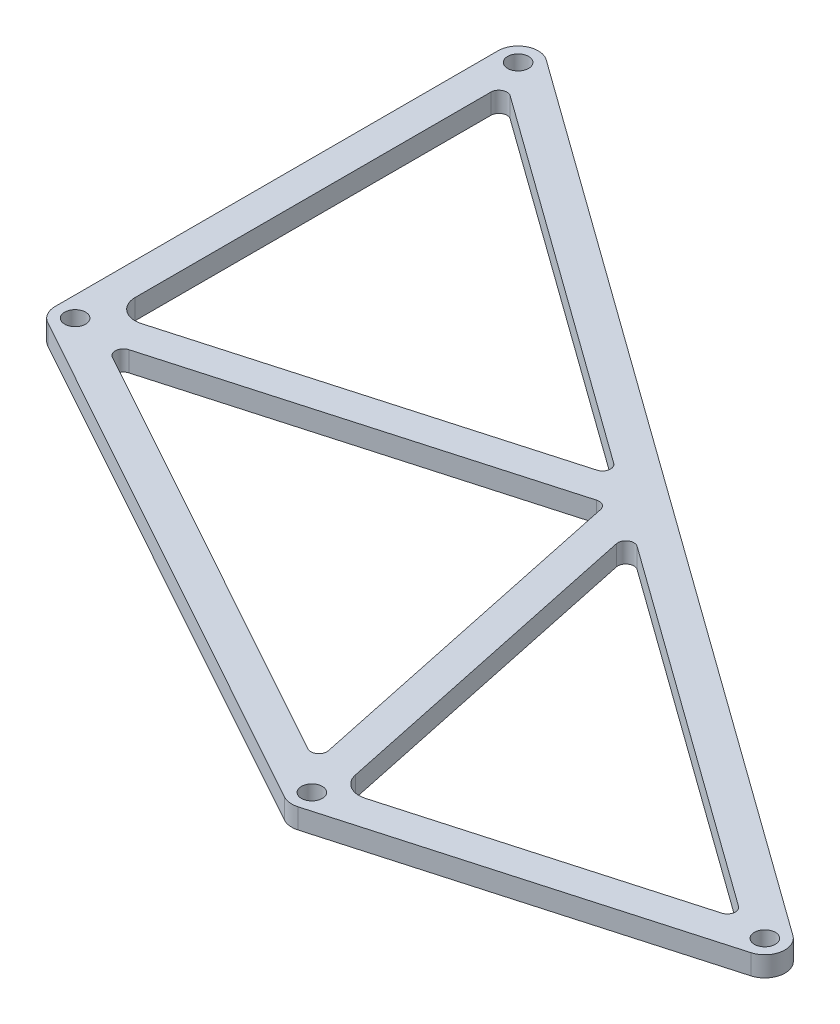
ISO-10303-21;
HEADER;
FILE_DESCRIPTION(('STEP AP214'),'2;1');
FILE_NAME('part.step','',(''),(''),'','','');
FILE_SCHEMA(('AUTOMOTIVE_DESIGN { 1 0 10303 214 1 1 1 1 }'));
ENDSEC;
DATA;
#1=APPLICATION_CONTEXT('core data for automotive mechanical design processes');
#2=APPLICATION_PROTOCOL_DEFINITION('international standard','automotive_design',2000,#1);
#3=PRODUCT_CONTEXT('',#1,'mechanical');
#4=PRODUCT('Part','Part','',(#3));
#5=PRODUCT_RELATED_PRODUCT_CATEGORY('part','',(#4));
#6=PRODUCT_DEFINITION_FORMATION('','',#4);
#7=PRODUCT_DEFINITION_CONTEXT('part definition',#1,'design');
#8=PRODUCT_DEFINITION('design','',#6,#7);
#9=PRODUCT_DEFINITION_SHAPE('','',#8);
#10=(LENGTH_UNIT() NAMED_UNIT(*) SI_UNIT(.MILLI.,.METRE.));
#11=(NAMED_UNIT(*) PLANE_ANGLE_UNIT() SI_UNIT($,.RADIAN.));
#12=(NAMED_UNIT(*) SI_UNIT($,.STERADIAN.) SOLID_ANGLE_UNIT());
#13=UNCERTAINTY_MEASURE_WITH_UNIT(LENGTH_MEASURE(1.E-05),#10,'distance_accuracy_value','');
#14=(GEOMETRIC_REPRESENTATION_CONTEXT(3) GLOBAL_UNCERTAINTY_ASSIGNED_CONTEXT((#13)) GLOBAL_UNIT_ASSIGNED_CONTEXT((#10,
#11,#12)) REPRESENTATION_CONTEXT('',''));
#15=CARTESIAN_POINT('',(0.,0.,0.));
#16=DIRECTION('',(0.,0.,1.));
#17=DIRECTION('',(1.,0.,0.));
#18=AXIS2_PLACEMENT_3D('',#15,#16,#17);
#19=CARTESIAN_POINT('',(-52.0637490387797,6.35,-91.7821141421089));
#20=DIRECTION('',(0.,1.,0.));
#21=DIRECTION('',(0.,0.,1.));
#22=AXIS2_PLACEMENT_3D('',#19,#20,#21);
#23=PLANE('',#22);
#24=CARTESIAN_POINT('',(-330.2,6.35,-152.4));
#25=DIRECTION('',(0.,1.,0.));
#26=DIRECTION('',(0.,0.,1.));
#27=AXIS2_PLACEMENT_3D('',#24,#25,#26);
#28=CIRCLE('',#27,3.30200000000004);
#29=CARTESIAN_POINT('',(-330.2,6.35,-149.098));
#30=VERTEX_POINT('',#29);
#31=EDGE_CURVE('E418',#30,#30,#28,.T.);
#32=ORIENTED_EDGE('',*,*,#31,.F.);
#33=EDGE_LOOP('',(#32));
#34=FACE_BOUND('',#33,.T.);
#35=CARTESIAN_POINT('',(-52.0637490387797,6.35,-91.7821141421089));
#36=DIRECTION('',(0.,1.,0.));
#37=DIRECTION('',(0.,0.,1.));
#38=AXIS2_PLACEMENT_3D('',#35,#36,#37);
#39=CIRCLE('',#38,3.302);
#40=CARTESIAN_POINT('',(-52.0637490387797,6.35,-88.4801141421089));
#41=VERTEX_POINT('',#40);
#42=EDGE_CURVE('E430',#41,#41,#39,.T.);
#43=ORIENTED_EDGE('',*,*,#42,.F.);
#44=EDGE_LOOP('',(#43));
#45=FACE_BOUND('',#44,.T.);
#46=CARTESIAN_POINT('',(-52.0637490387797,6.35,-91.7821141421089));
#47=DIRECTION('',(0.,1.,0.));
#48=DIRECTION('',(0.,0.,1.));
#49=AXIS2_PLACEMENT_3D('',#46,#47,#48);
#50=CIRCLE('',#49,6.34999999999994);
#51=CARTESIAN_POINT('',(-50.3303107807158,6.35,-85.6732933225498));
#52=VERTEX_POINT('',#51);
#53=CARTESIAN_POINT('',(-48.3526846328268,6.35,-96.9348319662158));
#54=VERTEX_POINT('',#53);
#55=EDGE_CURVE('E259',#52,#54,#50,.T.);
#56=ORIENTED_EDGE('',*,*,#55,.T.);
#57=DIRECTION('',(-0.811451625843612,0.,-0.584419591488649));
#58=VECTOR('',#57,1.);
#59=CARTESIAN_POINT('',(-48.3526846328268,6.35,-96.9348319662158));
#60=LINE('',#59,#58);
#61=CARTESIAN_POINT('',(-326.488935594047,6.35,-297.252717824107));
#62=VERTEX_POINT('',#61);
#63=EDGE_CURVE('E248',#54,#62,#60,.T.);
#64=ORIENTED_EDGE('',*,*,#63,.T.);
#65=CARTESIAN_POINT('',(-330.2,6.35,-292.1));
#66=DIRECTION('',(0.,1.,0.));
#67=DIRECTION('',(0.,0.,1.));
#68=AXIS2_PLACEMENT_3D('',#65,#66,#67);
#69=CIRCLE('',#68,6.34999999999996);
#70=CARTESIAN_POINT('',(-336.55,6.35,-292.1));
#71=VERTEX_POINT('',#70);
#72=EDGE_CURVE('E258',#62,#71,#69,.T.);
#73=ORIENTED_EDGE('',*,*,#72,.T.);
#74=DIRECTION('',(0.,0.,1.));
#75=VECTOR('',#74,1.);
#76=CARTESIAN_POINT('',(-336.55,6.35,-292.1));
#77=LINE('',#76,#75);
#78=CARTESIAN_POINT('',(-336.55,6.35,-152.4));
#79=VERTEX_POINT('',#78);
#80=EDGE_CURVE('E436',#71,#79,#77,.T.);
#81=ORIENTED_EDGE('',*,*,#80,.T.);
#82=CARTESIAN_POINT('',(-330.2,6.35,-152.4));
#83=DIRECTION('',(0.,1.,0.));
#84=DIRECTION('',(0.,0.,-1.));
#85=AXIS2_PLACEMENT_3D('',#82,#83,#84);
#86=CIRCLE('',#85,6.34999999999993);
#87=CARTESIAN_POINT('',(-333.271040517712,6.35,-146.842013841456));
#88=VERTEX_POINT('',#87);
#89=EDGE_CURVE('E438',#79,#88,#86,.T.);
#90=ORIENTED_EDGE('',*,*,#89,.T.);
#91=DIRECTION('',(0.875273410794368,0.,0.48362842798619));
#92=VECTOR('',#91,1.);
#93=CARTESIAN_POINT('',(-166.415977763352,6.35,-54.6469914561744));
#94=LINE('',#93,#92);
#95=CARTESIAN_POINT('',(-166.415977763352,6.35,-54.6469914561744));
#96=VERTEX_POINT('',#95);
#97=EDGE_CURVE('E440',#88,#96,#94,.T.);
#98=ORIENTED_EDGE('',*,*,#97,.T.);
#99=CARTESIAN_POINT('',(-163.34493724564,6.35,-60.2049776147186));
#100=DIRECTION('',(0.,1.,0.));
#101=DIRECTION('',(0.,0.,-1.));
#102=AXIS2_PLACEMENT_3D('',#99,#100,#101);
#103=CIRCLE('',#102,6.34999999999996);
#104=CARTESIAN_POINT('',(-161.611498987576,6.35,-54.0961567951594));
#105=VERTEX_POINT('',#104);
#106=EDGE_CURVE('E442',#96,#105,#103,.T.);
#107=ORIENTED_EDGE('',*,*,#106,.T.);
#108=DIRECTION('',(0.96201902670224,0.,-0.272982402844717));
#109=VECTOR('',#108,1.);
#110=CARTESIAN_POINT('',(-161.611498987576,6.35,-54.0961567951594));
#111=LINE('',#110,#109);
#112=EDGE_CURVE('E264',#105,#52,#111,.T.);
#113=ORIENTED_EDGE('',*,*,#112,.T.);
#114=EDGE_LOOP('',(#56,#64,#73,#81,#90,#98,#107,#113));
#115=FACE_BOUND('',#114,.T.);
#116=CARTESIAN_POINT('',(-163.34493724564,6.35,-60.2049776147186));
#117=DIRECTION('',(0.,1.,0.));
#118=DIRECTION('',(0.,0.,1.));
#119=AXIS2_PLACEMENT_3D('',#116,#117,#118);
#120=CIRCLE('',#119,3.30200000000004);
#121=CARTESIAN_POINT('',(-163.34493724564,6.35,-56.9029776147185));
#122=VERTEX_POINT('',#121);
#123=EDGE_CURVE('E424',#122,#122,#120,.T.);
#124=ORIENTED_EDGE('',*,*,#123,.F.);
#125=EDGE_LOOP('',(#124));
#126=FACE_BOUND('',#125,.T.);
#127=CARTESIAN_POINT('',(-330.2,6.35,-292.1));
#128=DIRECTION('',(0.,1.,0.));
#129=DIRECTION('',(0.,0.,1.));
#130=AXIS2_PLACEMENT_3D('',#127,#128,#129);
#131=CIRCLE('',#130,3.30200000000004);
#132=CARTESIAN_POINT('',(-330.2,6.35,-288.798));
#133=VERTEX_POINT('',#132);
#134=EDGE_CURVE('E412',#133,#133,#131,.T.);
#135=ORIENTED_EDGE('',*,*,#134,.F.);
#136=EDGE_LOOP('',(#135));
#137=FACE_BOUND('',#136,.T.);
#138=DIRECTION('',(0.811451625843611,0.,0.584419591488649));
#139=VECTOR('',#138,1.);
#140=CARTESIAN_POINT('',(-326.39,6.35,-284.660691911492));
#141=LINE('',#140,#139);
#142=CARTESIAN_POINT('',(-322.365574237619,6.35,-281.762240315462));
#143=VERTEX_POINT('',#142);
#144=CARTESIAN_POINT('',(-205.622667968464,6.35,-197.682254006868));
#145=VERTEX_POINT('',#144);
#146=EDGE_CURVE('E386',#143,#145,#141,.T.);
#147=ORIENTED_EDGE('',*,*,#146,.T.);
#148=CARTESIAN_POINT('',(-207.107093730845,6.35,-195.621166877225));
#149=DIRECTION('',(0.,1.,0.));
#150=DIRECTION('',(0.,0.,1.));
#151=AXIS2_PLACEMENT_3D('',#148,#149,#150);
#152=CIRCLE('',#151,2.54);
#153=CARTESIAN_POINT('',(-206.41243240115,6.35,-193.178003837839));
#154=VERTEX_POINT('',#153);
#155=EDGE_CURVE('E85',#145,#154,#152,.F.);
#156=ORIENTED_EDGE('',*,*,#155,.T.);
#157=DIRECTION('',(-0.961875212356985,0.,0.273488712478604));
#158=VECTOR('',#157,1.);
#159=CARTESIAN_POINT('',(-201.362327899527,6.35,-194.613893400526));
#160=LINE('',#159,#158);
#161=CARTESIAN_POINT('',(-318.303346675761,6.35,-161.364207526327));
#162=VERTEX_POINT('',#161);
#163=EDGE_CURVE('E408',#154,#162,#160,.T.);
#164=ORIENTED_EDGE('',*,*,#163,.T.);
#165=CARTESIAN_POINT('',(-320.04,6.35,-167.472115124794));
#166=DIRECTION('',(0.,1.,0.));
#167=DIRECTION('',(0.,0.,1.));
#168=AXIS2_PLACEMENT_3D('',#165,#166,#167);
#169=CIRCLE('',#168,6.35);
#170=CARTESIAN_POINT('',(-326.39,6.35,-167.472115124794));
#171=VERTEX_POINT('',#170);
#172=EDGE_CURVE('E312',#162,#171,#169,.F.);
#173=ORIENTED_EDGE('',*,*,#172,.T.);
#174=DIRECTION('',(0.,0.,-1.));
#175=VECTOR('',#174,1.);
#176=CARTESIAN_POINT('',(-326.39,6.35,-159.064940035602));
#177=LINE('',#176,#175);
#178=CARTESIAN_POINT('',(-326.39,6.35,-279.701153185819));
#179=VERTEX_POINT('',#178);
#180=EDGE_CURVE('E401',#171,#179,#177,.T.);
#181=ORIENTED_EDGE('',*,*,#180,.T.);
#182=CARTESIAN_POINT('',(-323.85,6.35,-279.701153185819));
#183=DIRECTION('',(0.,1.,0.));
#184=DIRECTION('',(0.,0.,1.));
#185=AXIS2_PLACEMENT_3D('',#182,#183,#184);
#186=CIRCLE('',#185,2.54);
#187=EDGE_CURVE('E332',#179,#143,#186,.F.);
#188=ORIENTED_EDGE('',*,*,#187,.T.);
#189=EDGE_LOOP('',(#147,#156,#164,#173,#181,#188));
#190=FACE_BOUND('',#189,.T.);
#191=DIRECTION('',(-0.206387599573482,0.,-0.978470315718518));
#192=VECTOR('',#191,1.);
#193=CARTESIAN_POINT('',(-159.839017864804,6.35,-65.1602375050574));
#194=LINE('',#193,#192);
#195=CARTESIAN_POINT('',(-161.242729048392,6.35,-71.8151418104572));
#196=VERTEX_POINT('',#195);
#197=CARTESIAN_POINT('',(-183.243670348003,6.35,-176.120187385014));
#198=VERTEX_POINT('',#197);
#199=EDGE_CURVE('E717',#196,#198,#194,.T.);
#200=ORIENTED_EDGE('',*,*,#199,.T.);
#201=CARTESIAN_POINT('',(-180.758355746078,6.35,-176.644411887931));
#202=DIRECTION('',(0.,1.,0.));
#203=DIRECTION('',(0.,0.,1.));
#204=AXIS2_PLACEMENT_3D('',#201,#202,#203);
#205=CIRCLE('',#204,2.54);
#206=CARTESIAN_POINT('',(-179.273929983697,6.35,-178.705499017573));
#207=VERTEX_POINT('',#206);
#208=EDGE_CURVE('E350',#198,#207,#205,.F.);
#209=ORIENTED_EDGE('',*,*,#208,.T.);
#210=DIRECTION('',(0.811451625843612,0.,0.584419591488649));
#211=VECTOR('',#210,1.);
#212=CARTESIAN_POINT('',(-184.597750493487,6.35,-182.539794135604));
#213=LINE('',#212,#211);
#214=CARTESIAN_POINT('',(-64.9483916318391,6.35,-96.3665372207435));
#215=VERTEX_POINT('',#214);
#216=EDGE_CURVE('E722',#207,#215,#213,.T.);
#217=ORIENTED_EDGE('',*,*,#216,.T.);
#218=CARTESIAN_POINT('',(-66.4328173942203,6.35,-94.3054500911007));
#219=DIRECTION('',(0.,1.,0.));
#220=DIRECTION('',(0.,0.,1.));
#221=AXIS2_PLACEMENT_3D('',#218,#219,#220);
#222=CIRCLE('',#221,2.54);
#223=CARTESIAN_POINT('',(-65.7394420909947,6.35,-91.8619217632771));
#224=VERTEX_POINT('',#223);
#225=EDGE_CURVE('E327',#215,#224,#222,.F.);
#226=ORIENTED_EDGE('',*,*,#225,.T.);
#227=DIRECTION('',(-0.962019026702239,0.,0.272982402844717));
#228=VECTOR('',#227,1.);
#229=CARTESIAN_POINT('',(-60.6851900520441,6.35,-93.296115711504));
#230=LINE('',#229,#228);
#231=CARTESIAN_POINT('',(-153.296004285515,6.35,-67.0168822481896));
#232=VERTEX_POINT('',#231);
#233=EDGE_CURVE('E395',#224,#232,#230,.T.);
#234=ORIENTED_EDGE('',*,*,#233,.T.);
#235=CARTESIAN_POINT('',(-155.029442543579,6.35,-73.1257030677488));
#236=DIRECTION('',(0.,1.,0.));
#237=DIRECTION('',(0.,0.,1.));
#238=AXIS2_PLACEMENT_3D('',#235,#236,#237);
#239=CIRCLE('',#238,6.35);
#240=EDGE_CURVE('E283',#232,#196,#239,.F.);
#241=ORIENTED_EDGE('',*,*,#240,.T.);
#242=EDGE_LOOP('',(#200,#209,#217,#226,#234,#241));
#243=FACE_BOUND('',#242,.T.);
#244=DIRECTION('',(0.961875212356985,0.,-0.273488712478603));
#245=VECTOR('',#244,1.);
#246=CARTESIAN_POINT('',(-319.046617377277,6.35,-150.590173624584));
#247=LINE('',#246,#245);
#248=CARTESIAN_POINT('',(-313.118269735869,6.35,-152.275772902687));
#249=VERTEX_POINT('',#248);
#250=CARTESIAN_POINT('',(-198.26129759639,6.35,-184.932904541046));
#251=VERTEX_POINT('',#250);
#252=EDGE_CURVE('E381',#249,#251,#247,.T.);
#253=ORIENTED_EDGE('',*,*,#252,.T.);
#254=CARTESIAN_POINT('',(-197.566636266695,6.35,-182.489741501659));
#255=DIRECTION('',(0.,1.,0.));
#256=DIRECTION('',(0.,0.,1.));
#257=AXIS2_PLACEMENT_3D('',#254,#255,#256);
#258=CIRCLE('',#257,2.54);
#259=CARTESIAN_POINT('',(-195.08132166477,6.35,-183.013966004576));
#260=VERTEX_POINT('',#259);
#261=EDGE_CURVE('E354',#251,#260,#258,.F.);
#262=ORIENTED_EDGE('',*,*,#261,.T.);
#263=DIRECTION('',(0.206387599573481,0.,0.978470315718518));
#264=VECTOR('',#263,1.);
#265=CARTESIAN_POINT('',(-195.643102449475,6.35,-185.677332519383));
#266=LINE('',#265,#264);
#267=CARTESIAN_POINT('',(-172.131968910559,6.35,-74.2125628129398));
#268=VERTEX_POINT('',#267);
#269=EDGE_CURVE('E379',#260,#268,#266,.T.);
#270=ORIENTED_EDGE('',*,*,#269,.T.);
#271=CARTESIAN_POINT('',(-174.617283512484,6.35,-73.6883383100232));
#272=DIRECTION('',(0.,1.,0.));
#273=DIRECTION('',(0.,0.,1.));
#274=AXIS2_PLACEMENT_3D('',#271,#272,#273);
#275=CIRCLE('',#274,2.54);
#276=CARTESIAN_POINT('',(-175.845699719569,6.35,-71.4651438466055));
#277=VERTEX_POINT('',#276);
#278=EDGE_CURVE('E293',#268,#277,#275,.F.);
#279=ORIENTED_EDGE('',*,*,#278,.T.);
#280=DIRECTION('',(-0.875273410794368,0.,-0.48362842798619));
#281=VECTOR('',#280,1.);
#282=CARTESIAN_POINT('',(-170.98608126535,6.35,-68.779983296037));
#283=LINE('',#282,#281);
#284=CARTESIAN_POINT('',(-313.652024613258,6.35,-147.609415399882));
#285=VERTEX_POINT('',#284);
#286=EDGE_CURVE('E374',#277,#285,#283,.T.);
#287=ORIENTED_EDGE('',*,*,#286,.T.);
#288=CARTESIAN_POINT('',(-312.423608406173,6.35,-149.8326098633));
#289=DIRECTION('',(0.,1.,0.));
#290=DIRECTION('',(0.,0.,1.));
#291=AXIS2_PLACEMENT_3D('',#288,#289,#290);
#292=CIRCLE('',#291,2.54);
#293=EDGE_CURVE('E303',#285,#249,#292,.F.);
#294=ORIENTED_EDGE('',*,*,#293,.T.);
#295=EDGE_LOOP('',(#253,#262,#270,#279,#287,#294));
#296=FACE_BOUND('',#295,.T.);
#297=ADVANCED_FACE('F77',(#34,#45,#115,#126,#137,#190,#243,#296),#23,.T.);
#298=CARTESIAN_POINT('',(-52.0637490387797,0.,-91.7821141421089));
#299=DIRECTION('',(0.,1.,0.));
#300=DIRECTION('',(0.,0.,1.));
#301=AXIS2_PLACEMENT_3D('',#298,#299,#300);
#302=PLANE('',#301);
#303=DIRECTION('',(-0.962019026702239,0.,0.272982402844717));
#304=VECTOR('',#303,1.);
#305=CARTESIAN_POINT('',(-60.6851900520441,0.,-93.296115711504));
#306=LINE('',#305,#304);
#307=CARTESIAN_POINT('',(-65.7394420909947,0.,-91.8619217632771));
#308=VERTEX_POINT('',#307);
#309=CARTESIAN_POINT('',(-153.296004285515,0.,-67.0168822481896));
#310=VERTEX_POINT('',#309);
#311=EDGE_CURVE('E725',#308,#310,#306,.T.);
#312=ORIENTED_EDGE('',*,*,#311,.F.);
#313=CARTESIAN_POINT('',(-66.4328173942203,0.,-94.3054500911007));
#314=DIRECTION('',(0.,1.,0.));
#315=DIRECTION('',(0.,0.,1.));
#316=AXIS2_PLACEMENT_3D('',#313,#314,#315);
#317=CIRCLE('',#316,2.54);
#318=CARTESIAN_POINT('',(-64.9483916318391,0.,-96.3665372207435));
#319=VERTEX_POINT('',#318);
#320=EDGE_CURVE('E329',#308,#319,#317,.T.);
#321=ORIENTED_EDGE('',*,*,#320,.T.);
#322=DIRECTION('',(0.811451625843612,0.,0.584419591488649));
#323=VECTOR('',#322,1.);
#324=CARTESIAN_POINT('',(-184.597750493487,0.,-182.539794135604));
#325=LINE('',#324,#323);
#326=CARTESIAN_POINT('',(-179.273929983697,0.,-178.705499017573));
#327=VERTEX_POINT('',#326);
#328=EDGE_CURVE('E728',#327,#319,#325,.T.);
#329=ORIENTED_EDGE('',*,*,#328,.F.);
#330=CARTESIAN_POINT('',(-180.758355746078,0.,-176.644411887931));
#331=DIRECTION('',(0.,1.,0.));
#332=DIRECTION('',(0.,0.,1.));
#333=AXIS2_PLACEMENT_3D('',#330,#331,#332);
#334=CIRCLE('',#333,2.54);
#335=CARTESIAN_POINT('',(-183.243670348003,0.,-176.120187385014));
#336=VERTEX_POINT('',#335);
#337=EDGE_CURVE('E352',#327,#336,#334,.T.);
#338=ORIENTED_EDGE('',*,*,#337,.T.);
#339=DIRECTION('',(-0.206387599573482,0.,-0.978470315718518));
#340=VECTOR('',#339,1.);
#341=CARTESIAN_POINT('',(-159.839017864804,0.,-65.1602375050574));
#342=LINE('',#341,#340);
#343=CARTESIAN_POINT('',(-161.242729048392,0.,-71.8151418104572));
#344=VERTEX_POINT('',#343);
#345=EDGE_CURVE('E730',#344,#336,#342,.T.);
#346=ORIENTED_EDGE('',*,*,#345,.F.);
#347=CARTESIAN_POINT('',(-155.029442543579,0.,-73.1257030677488));
#348=DIRECTION('',(0.,1.,0.));
#349=DIRECTION('',(0.,0.,1.));
#350=AXIS2_PLACEMENT_3D('',#347,#348,#349);
#351=CIRCLE('',#350,6.35);
#352=EDGE_CURVE('E285',#344,#310,#351,.T.);
#353=ORIENTED_EDGE('',*,*,#352,.T.);
#354=EDGE_LOOP('',(#312,#321,#329,#338,#346,#353));
#355=FACE_BOUND('',#354,.T.);
#356=CARTESIAN_POINT('',(-330.2,0.,-292.1));
#357=DIRECTION('',(0.,1.,0.));
#358=DIRECTION('',(0.,0.,1.));
#359=AXIS2_PLACEMENT_3D('',#356,#357,#358);
#360=CIRCLE('',#359,3.30200000000004);
#361=CARTESIAN_POINT('',(-330.2,0.,-288.798));
#362=VERTEX_POINT('',#361);
#363=EDGE_CURVE('E406',#362,#362,#360,.T.);
#364=ORIENTED_EDGE('',*,*,#363,.T.);
#365=EDGE_LOOP('',(#364));
#366=FACE_BOUND('',#365,.T.);
#367=CARTESIAN_POINT('',(-330.2,0.,-152.4));
#368=DIRECTION('',(0.,1.,0.));
#369=DIRECTION('',(0.,0.,1.));
#370=AXIS2_PLACEMENT_3D('',#367,#368,#369);
#371=CIRCLE('',#370,3.30200000000004);
#372=CARTESIAN_POINT('',(-330.2,0.,-149.098));
#373=VERTEX_POINT('',#372);
#374=EDGE_CURVE('E415',#373,#373,#371,.T.);
#375=ORIENTED_EDGE('',*,*,#374,.T.);
#376=EDGE_LOOP('',(#375));
#377=FACE_BOUND('',#376,.T.);
#378=CARTESIAN_POINT('',(-163.34493724564,0.,-60.2049776147186));
#379=DIRECTION('',(0.,1.,0.));
#380=DIRECTION('',(0.,0.,1.));
#381=AXIS2_PLACEMENT_3D('',#378,#379,#380);
#382=CIRCLE('',#381,3.30200000000004);
#383=CARTESIAN_POINT('',(-163.34493724564,0.,-56.9029776147185));
#384=VERTEX_POINT('',#383);
#385=EDGE_CURVE('E421',#384,#384,#382,.T.);
#386=ORIENTED_EDGE('',*,*,#385,.T.);
#387=EDGE_LOOP('',(#386));
#388=FACE_BOUND('',#387,.T.);
#389=CARTESIAN_POINT('',(-52.0637490387797,0.,-91.7821141421089));
#390=DIRECTION('',(0.,1.,0.));
#391=DIRECTION('',(0.,0.,1.));
#392=AXIS2_PLACEMENT_3D('',#389,#390,#391);
#393=CIRCLE('',#392,3.302);
#394=CARTESIAN_POINT('',(-52.0637490387797,0.,-88.4801141421089));
#395=VERTEX_POINT('',#394);
#396=EDGE_CURVE('E427',#395,#395,#393,.T.);
#397=ORIENTED_EDGE('',*,*,#396,.T.);
#398=EDGE_LOOP('',(#397));
#399=FACE_BOUND('',#398,.T.);
#400=CARTESIAN_POINT('',(-52.0637490387797,0.,-91.7821141421089));
#401=DIRECTION('',(0.,1.,0.));
#402=DIRECTION('',(0.,0.,1.));
#403=AXIS2_PLACEMENT_3D('',#400,#401,#402);
#404=CIRCLE('',#403,6.34999999999994);
#405=CARTESIAN_POINT('',(-50.3303107807158,0.,-85.6732933225498));
#406=VERTEX_POINT('',#405);
#407=CARTESIAN_POINT('',(-48.3526846328268,0.,-96.9348319662158));
#408=VERTEX_POINT('',#407);
#409=EDGE_CURVE('E272',#406,#408,#404,.T.);
#410=ORIENTED_EDGE('',*,*,#409,.F.);
#411=DIRECTION('',(0.96201902670224,0.,-0.272982402844717));
#412=VECTOR('',#411,1.);
#413=CARTESIAN_POINT('',(-161.611498987576,0.,-54.0961567951594));
#414=LINE('',#413,#412);
#415=CARTESIAN_POINT('',(-161.611498987576,0.,-54.0961567951594));
#416=VERTEX_POINT('',#415);
#417=EDGE_CURVE('E268',#416,#406,#414,.T.);
#418=ORIENTED_EDGE('',*,*,#417,.F.);
#419=CARTESIAN_POINT('',(-163.34493724564,0.,-60.2049776147186));
#420=DIRECTION('',(0.,1.,0.));
#421=DIRECTION('',(0.,0.,-1.));
#422=AXIS2_PLACEMENT_3D('',#419,#420,#421);
#423=CIRCLE('',#422,6.34999999999996);
#424=CARTESIAN_POINT('',(-166.415977763352,0.,-54.6469914561744));
#425=VERTEX_POINT('',#424);
#426=EDGE_CURVE('E457',#425,#416,#423,.T.);
#427=ORIENTED_EDGE('',*,*,#426,.F.);
#428=DIRECTION('',(0.875273410794368,0.,0.48362842798619));
#429=VECTOR('',#428,1.);
#430=CARTESIAN_POINT('',(-166.415977763352,0.,-54.6469914561744));
#431=LINE('',#430,#429);
#432=CARTESIAN_POINT('',(-333.271040517712,0.,-146.842013841456));
#433=VERTEX_POINT('',#432);
#434=EDGE_CURVE('E455',#433,#425,#431,.T.);
#435=ORIENTED_EDGE('',*,*,#434,.F.);
#436=CARTESIAN_POINT('',(-330.2,0.,-152.4));
#437=DIRECTION('',(0.,1.,0.));
#438=DIRECTION('',(0.,0.,-1.));
#439=AXIS2_PLACEMENT_3D('',#436,#437,#438);
#440=CIRCLE('',#439,6.34999999999993);
#441=CARTESIAN_POINT('',(-336.55,0.,-152.4));
#442=VERTEX_POINT('',#441);
#443=EDGE_CURVE('E453',#442,#433,#440,.T.);
#444=ORIENTED_EDGE('',*,*,#443,.F.);
#445=DIRECTION('',(0.,0.,1.));
#446=VECTOR('',#445,1.);
#447=CARTESIAN_POINT('',(-336.55,0.,-292.1));
#448=LINE('',#447,#446);
#449=CARTESIAN_POINT('',(-336.55,0.,-292.1));
#450=VERTEX_POINT('',#449);
#451=EDGE_CURVE('E451',#450,#442,#448,.T.);
#452=ORIENTED_EDGE('',*,*,#451,.F.);
#453=CARTESIAN_POINT('',(-330.2,0.,-292.1));
#454=DIRECTION('',(0.,1.,0.));
#455=DIRECTION('',(0.,0.,1.));
#456=AXIS2_PLACEMENT_3D('',#453,#454,#455);
#457=CIRCLE('',#456,6.34999999999996);
#458=CARTESIAN_POINT('',(-326.488935594047,0.,-297.252717824107));
#459=VERTEX_POINT('',#458);
#460=EDGE_CURVE('E449',#459,#450,#457,.T.);
#461=ORIENTED_EDGE('',*,*,#460,.F.);
#462=DIRECTION('',(-0.811451625843612,0.,-0.584419591488649));
#463=VECTOR('',#462,1.);
#464=CARTESIAN_POINT('',(-48.3526846328268,0.,-96.9348319662158));
#465=LINE('',#464,#463);
#466=EDGE_CURVE('E447',#408,#459,#465,.T.);
#467=ORIENTED_EDGE('',*,*,#466,.F.);
#468=EDGE_LOOP('',(#410,#418,#427,#435,#444,#452,#461,#467));
#469=FACE_BOUND('',#468,.T.);
#470=DIRECTION('',(0.811451625843611,0.,0.584419591488649));
#471=VECTOR('',#470,1.);
#472=CARTESIAN_POINT('',(-326.39,0.,-284.660691911492));
#473=LINE('',#472,#471);
#474=CARTESIAN_POINT('',(-322.365574237619,0.,-281.762240315462));
#475=VERTEX_POINT('',#474);
#476=CARTESIAN_POINT('',(-205.622667968464,0.,-197.682254006868));
#477=VERTEX_POINT('',#476);
#478=EDGE_CURVE('E397',#475,#477,#473,.T.);
#479=ORIENTED_EDGE('',*,*,#478,.F.);
#480=CARTESIAN_POINT('',(-323.85,0.,-279.701153185819));
#481=DIRECTION('',(0.,1.,0.));
#482=DIRECTION('',(0.,0.,1.));
#483=AXIS2_PLACEMENT_3D('',#480,#481,#482);
#484=CIRCLE('',#483,2.54);
#485=CARTESIAN_POINT('',(-326.39,0.,-279.701153185819));
#486=VERTEX_POINT('',#485);
#487=EDGE_CURVE('E334',#475,#486,#484,.T.);
#488=ORIENTED_EDGE('',*,*,#487,.T.);
#489=DIRECTION('',(0.,0.,-1.));
#490=VECTOR('',#489,1.);
#491=CARTESIAN_POINT('',(-326.39,0.,-159.064940035602));
#492=LINE('',#491,#490);
#493=CARTESIAN_POINT('',(-326.39,0.,-167.472115124794));
#494=VERTEX_POINT('',#493);
#495=EDGE_CURVE('E403',#494,#486,#492,.T.);
#496=ORIENTED_EDGE('',*,*,#495,.F.);
#497=CARTESIAN_POINT('',(-320.04,0.,-167.472115124794));
#498=DIRECTION('',(0.,1.,0.));
#499=DIRECTION('',(0.,0.,1.));
#500=AXIS2_PLACEMENT_3D('',#497,#498,#499);
#501=CIRCLE('',#500,6.35);
#502=CARTESIAN_POINT('',(-318.303346675761,0.,-161.364207526327));
#503=VERTEX_POINT('',#502);
#504=EDGE_CURVE('E314',#494,#503,#501,.T.);
#505=ORIENTED_EDGE('',*,*,#504,.T.);
#506=DIRECTION('',(-0.961875212356985,0.,0.273488712478604));
#507=VECTOR('',#506,1.);
#508=CARTESIAN_POINT('',(-201.362327899527,0.,-194.613893400526));
#509=LINE('',#508,#507);
#510=CARTESIAN_POINT('',(-206.41243240115,0.,-193.178003837839));
#511=VERTEX_POINT('',#510);
#512=EDGE_CURVE('E400',#511,#503,#509,.T.);
#513=ORIENTED_EDGE('',*,*,#512,.F.);
#514=CARTESIAN_POINT('',(-207.107093730845,0.,-195.621166877225));
#515=DIRECTION('',(0.,1.,0.));
#516=DIRECTION('',(0.,0.,1.));
#517=AXIS2_PLACEMENT_3D('',#514,#515,#516);
#518=CIRCLE('',#517,2.54);
#519=EDGE_CURVE('E12',#511,#477,#518,.T.);
#520=ORIENTED_EDGE('',*,*,#519,.T.);
#521=EDGE_LOOP('',(#479,#488,#496,#505,#513,#520));
#522=FACE_BOUND('',#521,.T.);
#523=DIRECTION('',(0.961875212356985,0.,-0.273488712478603));
#524=VECTOR('',#523,1.);
#525=CARTESIAN_POINT('',(-319.046617377277,0.,-150.590173624584));
#526=LINE('',#525,#524);
#527=CARTESIAN_POINT('',(-313.118269735869,0.,-152.275772902687));
#528=VERTEX_POINT('',#527);
#529=CARTESIAN_POINT('',(-198.26129759639,0.,-184.932904541046));
#530=VERTEX_POINT('',#529);
#531=EDGE_CURVE('E363',#528,#530,#526,.T.);
#532=ORIENTED_EDGE('',*,*,#531,.F.);
#533=CARTESIAN_POINT('',(-312.423608406173,0.,-149.8326098633));
#534=DIRECTION('',(0.,1.,0.));
#535=DIRECTION('',(0.,0.,1.));
#536=AXIS2_PLACEMENT_3D('',#533,#534,#535);
#537=CIRCLE('',#536,2.54);
#538=CARTESIAN_POINT('',(-313.652024613258,0.,-147.609415399882));
#539=VERTEX_POINT('',#538);
#540=EDGE_CURVE('E305',#528,#539,#537,.T.);
#541=ORIENTED_EDGE('',*,*,#540,.T.);
#542=DIRECTION('',(-0.875273410794368,0.,-0.48362842798619));
#543=VECTOR('',#542,1.);
#544=CARTESIAN_POINT('',(-170.98608126535,0.,-68.779983296037));
#545=LINE('',#544,#543);
#546=CARTESIAN_POINT('',(-175.845699719569,0.,-71.4651438466055));
#547=VERTEX_POINT('',#546);
#548=EDGE_CURVE('E392',#547,#539,#545,.T.);
#549=ORIENTED_EDGE('',*,*,#548,.F.);
#550=CARTESIAN_POINT('',(-174.617283512484,0.,-73.6883383100232));
#551=DIRECTION('',(0.,1.,0.));
#552=DIRECTION('',(0.,0.,1.));
#553=AXIS2_PLACEMENT_3D('',#550,#551,#552);
#554=CIRCLE('',#553,2.54);
#555=CARTESIAN_POINT('',(-172.131968910559,0.,-74.2125628129398));
#556=VERTEX_POINT('',#555);
#557=EDGE_CURVE('E295',#547,#556,#554,.T.);
#558=ORIENTED_EDGE('',*,*,#557,.T.);
#559=DIRECTION('',(0.206387599573481,0.,0.978470315718518));
#560=VECTOR('',#559,1.);
#561=CARTESIAN_POINT('',(-195.643102449475,0.,-185.677332519383));
#562=LINE('',#561,#560);
#563=CARTESIAN_POINT('',(-195.08132166477,0.,-183.013966004576));
#564=VERTEX_POINT('',#563);
#565=EDGE_CURVE('E365',#564,#556,#562,.T.);
#566=ORIENTED_EDGE('',*,*,#565,.F.);
#567=CARTESIAN_POINT('',(-197.566636266695,0.,-182.489741501659));
#568=DIRECTION('',(0.,1.,0.));
#569=DIRECTION('',(0.,0.,1.));
#570=AXIS2_PLACEMENT_3D('',#567,#568,#569);
#571=CIRCLE('',#570,2.54);
#572=EDGE_CURVE('E356',#564,#530,#571,.T.);
#573=ORIENTED_EDGE('',*,*,#572,.T.);
#574=EDGE_LOOP('',(#532,#541,#549,#558,#566,#573));
#575=FACE_BOUND('',#574,.T.);
#576=ADVANCED_FACE('F362',(#355,#366,#377,#388,#399,#469,#522,#575),#302,.F.);
#577=CARTESIAN_POINT('',(-52.0637490387797,6.35,-91.7821141421089));
#578=DIRECTION('',(0.,-1.,0.));
#579=DIRECTION('',(0.,0.,-1.));
#580=AXIS2_PLACEMENT_3D('',#577,#578,#579);
#581=CYLINDRICAL_SURFACE('',#580,6.34999999999994);
#582=ORIENTED_EDGE('',*,*,#409,.T.);
#583=DIRECTION('',(0.,-1.,0.));
#584=VECTOR('',#583,1.);
#585=CARTESIAN_POINT('',(-48.3526846328268,6.35,-96.9348319662158));
#586=LINE('',#585,#584);
#587=EDGE_CURVE('E252',#54,#408,#586,.T.);
#588=ORIENTED_EDGE('',*,*,#587,.F.);
#589=ORIENTED_EDGE('',*,*,#55,.F.);
#590=DIRECTION('',(0.,-1.,0.));
#591=VECTOR('',#590,1.);
#592=CARTESIAN_POINT('',(-50.3303107807158,6.35,-85.6732933225498));
#593=LINE('',#592,#591);
#594=EDGE_CURVE('E445',#52,#406,#593,.T.);
#595=ORIENTED_EDGE('',*,*,#594,.T.);
#596=EDGE_LOOP('',(#582,#588,#589,#595));
#597=FACE_BOUND('',#596,.T.);
#598=ADVANCED_FACE('F270',(#597),#581,.T.);
#599=CARTESIAN_POINT('',(-48.3526846328268,6.35,-96.9348319662158));
#600=DIRECTION('',(-0.584419591488649,0.,0.811451625843612));
#601=DIRECTION('',(0.811451625843612,0.,0.584419591488649));
#602=AXIS2_PLACEMENT_3D('',#599,#600,#601);
#603=PLANE('',#602);
#604=ORIENTED_EDGE('',*,*,#466,.T.);
#605=DIRECTION('',(0.,-1.,0.));
#606=VECTOR('',#605,1.);
#607=CARTESIAN_POINT('',(-326.488935594047,6.35,-297.252717824107));
#608=LINE('',#607,#606);
#609=EDGE_CURVE('E255',#62,#459,#608,.T.);
#610=ORIENTED_EDGE('',*,*,#609,.F.);
#611=ORIENTED_EDGE('',*,*,#63,.F.);
#612=ORIENTED_EDGE('',*,*,#587,.T.);
#613=EDGE_LOOP('',(#604,#610,#611,#612));
#614=FACE_BOUND('',#613,.T.);
#615=ADVANCED_FACE('F250',(#614),#603,.F.);
#616=CARTESIAN_POINT('',(-330.2,6.35,-292.1));
#617=DIRECTION('',(0.,-1.,0.));
#618=DIRECTION('',(0.,0.,-1.));
#619=AXIS2_PLACEMENT_3D('',#616,#617,#618);
#620=CYLINDRICAL_SURFACE('',#619,6.34999999999996);
#621=ORIENTED_EDGE('',*,*,#460,.T.);
#622=DIRECTION('',(0.,-1.,0.));
#623=VECTOR('',#622,1.);
#624=CARTESIAN_POINT('',(-336.55,6.35,-292.1));
#625=LINE('',#624,#623);
#626=EDGE_CURVE('E278',#71,#450,#625,.T.);
#627=ORIENTED_EDGE('',*,*,#626,.F.);
#628=ORIENTED_EDGE('',*,*,#72,.F.);
#629=ORIENTED_EDGE('',*,*,#609,.T.);
#630=EDGE_LOOP('',(#621,#627,#628,#629));
#631=FACE_BOUND('',#630,.T.);
#632=ADVANCED_FACE('F496',(#631),#620,.T.);
#633=CARTESIAN_POINT('',(-336.55,6.35,-292.1));
#634=DIRECTION('',(1.,0.,0.));
#635=DIRECTION('',(0.,0.,-1.));
#636=AXIS2_PLACEMENT_3D('',#633,#634,#635);
#637=PLANE('',#636);
#638=ORIENTED_EDGE('',*,*,#451,.T.);
#639=DIRECTION('',(0.,-1.,0.));
#640=VECTOR('',#639,1.);
#641=CARTESIAN_POINT('',(-336.55,6.35,-152.4));
#642=LINE('',#641,#640);
#643=EDGE_CURVE('E470',#79,#442,#642,.T.);
#644=ORIENTED_EDGE('',*,*,#643,.F.);
#645=ORIENTED_EDGE('',*,*,#80,.F.);
#646=ORIENTED_EDGE('',*,*,#626,.T.);
#647=EDGE_LOOP('',(#638,#644,#645,#646));
#648=FACE_BOUND('',#647,.T.);
#649=ADVANCED_FACE('F477',(#648),#637,.F.);
#650=CARTESIAN_POINT('',(-330.2,6.35,-152.4));
#651=DIRECTION('',(0.,-1.,0.));
#652=DIRECTION('',(0.,0.,-1.));
#653=AXIS2_PLACEMENT_3D('',#650,#651,#652);
#654=CYLINDRICAL_SURFACE('',#653,6.34999999999993);
#655=ORIENTED_EDGE('',*,*,#443,.T.);
#656=DIRECTION('',(0.,-1.,0.));
#657=VECTOR('',#656,1.);
#658=CARTESIAN_POINT('',(-333.271040517712,6.35,-146.842013841456));
#659=LINE('',#658,#657);
#660=EDGE_CURVE('E467',#88,#433,#659,.T.);
#661=ORIENTED_EDGE('',*,*,#660,.F.);
#662=ORIENTED_EDGE('',*,*,#89,.F.);
#663=ORIENTED_EDGE('',*,*,#643,.T.);
#664=EDGE_LOOP('',(#655,#661,#662,#663));
#665=FACE_BOUND('',#664,.T.);
#666=ADVANCED_FACE('F488',(#665),#654,.T.);
#667=CARTESIAN_POINT('',(-166.415977763352,6.35,-54.6469914561744));
#668=DIRECTION('',(0.483628427986189,0.,-0.875273410794368));
#669=DIRECTION('',(-0.875273410794368,0.,-0.48362842798619));
#670=AXIS2_PLACEMENT_3D('',#667,#668,#669);
#671=PLANE('',#670);
#672=ORIENTED_EDGE('',*,*,#434,.T.);
#673=DIRECTION('',(0.,-1.,0.));
#674=VECTOR('',#673,1.);
#675=CARTESIAN_POINT('',(-166.415977763352,6.35,-54.6469914561744));
#676=LINE('',#675,#674);
#677=EDGE_CURVE('E464',#96,#425,#676,.T.);
#678=ORIENTED_EDGE('',*,*,#677,.F.);
#679=ORIENTED_EDGE('',*,*,#97,.F.);
#680=ORIENTED_EDGE('',*,*,#660,.T.);
#681=EDGE_LOOP('',(#672,#678,#679,#680));
#682=FACE_BOUND('',#681,.T.);
#683=ADVANCED_FACE('F492',(#682),#671,.F.);
#684=CARTESIAN_POINT('',(-163.34493724564,6.35,-60.2049776147186));
#685=DIRECTION('',(0.,-1.,0.));
#686=DIRECTION('',(0.,0.,-1.));
#687=AXIS2_PLACEMENT_3D('',#684,#685,#686);
#688=CYLINDRICAL_SURFACE('',#687,6.34999999999996);
#689=ORIENTED_EDGE('',*,*,#426,.T.);
#690=DIRECTION('',(0.,-1.,0.));
#691=VECTOR('',#690,1.);
#692=CARTESIAN_POINT('',(-161.611498987576,6.35,-54.0961567951594));
#693=LINE('',#692,#691);
#694=EDGE_CURVE('E461',#105,#416,#693,.T.);
#695=ORIENTED_EDGE('',*,*,#694,.F.);
#696=ORIENTED_EDGE('',*,*,#106,.F.);
#697=ORIENTED_EDGE('',*,*,#677,.T.);
#698=EDGE_LOOP('',(#689,#695,#696,#697));
#699=FACE_BOUND('',#698,.T.);
#700=ADVANCED_FACE('F523',(#699),#688,.T.);
#701=CARTESIAN_POINT('',(-161.611498987576,6.35,-54.0961567951594));
#702=DIRECTION('',(-0.272982402844717,0.,-0.96201902670224));
#703=DIRECTION('',(-0.96201902670224,0.,0.272982402844717));
#704=AXIS2_PLACEMENT_3D('',#701,#702,#703);
#705=PLANE('',#704);
#706=ORIENTED_EDGE('',*,*,#417,.T.);
#707=ORIENTED_EDGE('',*,*,#594,.F.);
#708=ORIENTED_EDGE('',*,*,#112,.F.);
#709=ORIENTED_EDGE('',*,*,#694,.T.);
#710=EDGE_LOOP('',(#706,#707,#708,#709));
#711=FACE_BOUND('',#710,.T.);
#712=ADVANCED_FACE('F520',(#711),#705,.F.);
#713=CARTESIAN_POINT('',(-52.0637490387797,6.35,-91.7821141421089));
#714=DIRECTION('',(0.,-1.,0.));
#715=DIRECTION('',(0.,0.,-1.));
#716=AXIS2_PLACEMENT_3D('',#713,#714,#715);
#717=CYLINDRICAL_SURFACE('',#716,3.302);
#718=ORIENTED_EDGE('',*,*,#42,.T.);
#719=EDGE_LOOP('',(#718));
#720=FACE_BOUND('',#719,.T.);
#721=ORIENTED_EDGE('',*,*,#396,.F.);
#722=EDGE_LOOP('',(#721));
#723=FACE_BOUND('',#722,.T.);
#724=ADVANCED_FACE('F517',(#720,#723),#717,.F.);
#725=CARTESIAN_POINT('',(-163.34493724564,6.35,-60.2049776147186));
#726=DIRECTION('',(0.,-1.,0.));
#727=DIRECTION('',(0.,0.,-1.));
#728=AXIS2_PLACEMENT_3D('',#725,#726,#727);
#729=CYLINDRICAL_SURFACE('',#728,3.30200000000004);
#730=ORIENTED_EDGE('',*,*,#123,.T.);
#731=EDGE_LOOP('',(#730));
#732=FACE_BOUND('',#731,.T.);
#733=ORIENTED_EDGE('',*,*,#385,.F.);
#734=EDGE_LOOP('',(#733));
#735=FACE_BOUND('',#734,.T.);
#736=ADVANCED_FACE('F557',(#732,#735),#729,.F.);
#737=CARTESIAN_POINT('',(-330.2,6.35,-152.4));
#738=DIRECTION('',(0.,-1.,0.));
#739=DIRECTION('',(0.,0.,-1.));
#740=AXIS2_PLACEMENT_3D('',#737,#738,#739);
#741=CYLINDRICAL_SURFACE('',#740,3.30200000000004);
#742=ORIENTED_EDGE('',*,*,#31,.T.);
#743=EDGE_LOOP('',(#742));
#744=FACE_BOUND('',#743,.T.);
#745=ORIENTED_EDGE('',*,*,#374,.F.);
#746=EDGE_LOOP('',(#745));
#747=FACE_BOUND('',#746,.T.);
#748=ADVANCED_FACE('F565',(#744,#747),#741,.F.);
#749=CARTESIAN_POINT('',(-330.2,6.35,-292.1));
#750=DIRECTION('',(0.,-1.,0.));
#751=DIRECTION('',(0.,0.,-1.));
#752=AXIS2_PLACEMENT_3D('',#749,#750,#751);
#753=CYLINDRICAL_SURFACE('',#752,3.30200000000004);
#754=ORIENTED_EDGE('',*,*,#134,.T.);
#755=EDGE_LOOP('',(#754));
#756=FACE_BOUND('',#755,.T.);
#757=ORIENTED_EDGE('',*,*,#363,.F.);
#758=EDGE_LOOP('',(#757));
#759=FACE_BOUND('',#758,.T.);
#760=ADVANCED_FACE('F573',(#756,#759),#753,.F.);
#761=CARTESIAN_POINT('',(-326.39,0.,-284.660691911492));
#762=DIRECTION('',(-0.584419591488649,0.,0.811451625843611));
#763=DIRECTION('',(0.811451625843612,0.,0.584419591488649));
#764=AXIS2_PLACEMENT_3D('',#761,#762,#763);
#765=PLANE('',#764);
#766=ORIENTED_EDGE('',*,*,#478,.T.);
#767=DIRECTION('',(0.,1.,0.));
#768=VECTOR('',#767,1.);
#769=CARTESIAN_POINT('',(-205.622667968464,6.35,-197.682254006868));
#770=LINE('',#769,#768);
#771=EDGE_CURVE('E346',#477,#145,#770,.T.);
#772=ORIENTED_EDGE('',*,*,#771,.T.);
#773=ORIENTED_EDGE('',*,*,#146,.F.);
#774=DIRECTION('',(0.,1.,0.));
#775=VECTOR('',#774,1.);
#776=CARTESIAN_POINT('',(-322.365574237619,0.,-281.762240315462));
#777=LINE('',#776,#775);
#778=EDGE_CURVE('E325',#143,#475,#777,.F.);
#779=ORIENTED_EDGE('',*,*,#778,.T.);
#780=EDGE_LOOP('',(#766,#772,#773,#779));
#781=FACE_BOUND('',#780,.T.);
#782=ADVANCED_FACE('F582',(#781),#765,.T.);
#783=CARTESIAN_POINT('',(-201.362327899527,0.,-194.613893400526));
#784=DIRECTION('',(-0.273488712478604,0.,-0.961875212356985));
#785=DIRECTION('',(-0.961875212356985,0.,0.273488712478604));
#786=AXIS2_PLACEMENT_3D('',#783,#784,#785);
#787=PLANE('',#786);
#788=ORIENTED_EDGE('',*,*,#163,.F.);
#789=DIRECTION('',(0.,1.,0.));
#790=VECTOR('',#789,1.);
#791=CARTESIAN_POINT('',(-206.41243240115,0.,-193.178003837839));
#792=LINE('',#791,#790);
#793=EDGE_CURVE('E98',#154,#511,#792,.F.);
#794=ORIENTED_EDGE('',*,*,#793,.T.);
#795=ORIENTED_EDGE('',*,*,#512,.T.);
#796=DIRECTION('',(0.,1.,0.));
#797=VECTOR('',#796,1.);
#798=CARTESIAN_POINT('',(-318.303346675761,6.35,-161.364207526327));
#799=LINE('',#798,#797);
#800=EDGE_CURVE('E307',#503,#162,#799,.T.);
#801=ORIENTED_EDGE('',*,*,#800,.T.);
#802=EDGE_LOOP('',(#788,#794,#795,#801));
#803=FACE_BOUND('',#802,.T.);
#804=ADVANCED_FACE('F642',(#803),#787,.T.);
#805=CARTESIAN_POINT('',(-326.39,0.,-159.064940035602));
#806=DIRECTION('',(1.,0.,0.));
#807=DIRECTION('',(0.,0.,-1.));
#808=AXIS2_PLACEMENT_3D('',#805,#806,#807);
#809=PLANE('',#808);
#810=ORIENTED_EDGE('',*,*,#495,.T.);
#811=DIRECTION('',(0.,1.,0.));
#812=VECTOR('',#811,1.);
#813=CARTESIAN_POINT('',(-326.39,6.35,-279.701153185819));
#814=LINE('',#813,#812);
#815=EDGE_CURVE('E322',#486,#179,#814,.T.);
#816=ORIENTED_EDGE('',*,*,#815,.T.);
#817=ORIENTED_EDGE('',*,*,#180,.F.);
#818=DIRECTION('',(0.,1.,0.));
#819=VECTOR('',#818,1.);
#820=CARTESIAN_POINT('',(-326.39,0.,-167.472115124794));
#821=LINE('',#820,#819);
#822=EDGE_CURVE('E310',#171,#494,#821,.F.);
#823=ORIENTED_EDGE('',*,*,#822,.T.);
#824=EDGE_LOOP('',(#810,#816,#817,#823));
#825=FACE_BOUND('',#824,.T.);
#826=ADVANCED_FACE('F637',(#825),#809,.T.);
#827=CARTESIAN_POINT('',(-60.6851900520441,0.,-93.296115711504));
#828=DIRECTION('',(-0.272982402844717,0.,-0.962019026702239));
#829=DIRECTION('',(-0.96201902670224,0.,0.272982402844717));
#830=AXIS2_PLACEMENT_3D('',#827,#828,#829);
#831=PLANE('',#830);
#832=ORIENTED_EDGE('',*,*,#233,.F.);
#833=DIRECTION('',(0.,1.,0.));
#834=VECTOR('',#833,1.);
#835=CARTESIAN_POINT('',(-65.7394420909947,0.,-91.8619217632771));
#836=LINE('',#835,#834);
#837=EDGE_CURVE('E320',#224,#308,#836,.F.);
#838=ORIENTED_EDGE('',*,*,#837,.T.);
#839=ORIENTED_EDGE('',*,*,#311,.T.);
#840=DIRECTION('',(0.,1.,0.));
#841=VECTOR('',#840,1.);
#842=CARTESIAN_POINT('',(-153.296004285515,6.35,-67.0168822481896));
#843=LINE('',#842,#841);
#844=EDGE_CURVE('E273',#310,#232,#843,.T.);
#845=ORIENTED_EDGE('',*,*,#844,.T.);
#846=EDGE_LOOP('',(#832,#838,#839,#845));
#847=FACE_BOUND('',#846,.T.);
#848=ADVANCED_FACE('F641',(#847),#831,.T.);
#849=CARTESIAN_POINT('',(-159.839017864804,0.,-65.1602375050574));
#850=DIRECTION('',(0.978470315718518,0.,-0.206387599573482));
#851=DIRECTION('',(-0.206387599573482,0.,-0.978470315718518));
#852=AXIS2_PLACEMENT_3D('',#849,#850,#851);
#853=PLANE('',#852);
#854=ORIENTED_EDGE('',*,*,#345,.T.);
#855=DIRECTION('',(0.,1.,0.));
#856=VECTOR('',#855,1.);
#857=CARTESIAN_POINT('',(-183.243670348003,6.35,-176.120187385014));
#858=LINE('',#857,#856);
#859=EDGE_CURVE('E336',#336,#198,#858,.T.);
#860=ORIENTED_EDGE('',*,*,#859,.T.);
#861=ORIENTED_EDGE('',*,*,#199,.F.);
#862=DIRECTION('',(0.,1.,0.));
#863=VECTOR('',#862,1.);
#864=CARTESIAN_POINT('',(-161.242729048392,0.,-71.8151418104572));
#865=LINE('',#864,#863);
#866=EDGE_CURVE('E276',#196,#344,#865,.F.);
#867=ORIENTED_EDGE('',*,*,#866,.T.);
#868=EDGE_LOOP('',(#854,#860,#861,#867));
#869=FACE_BOUND('',#868,.T.);
#870=ADVANCED_FACE('F652',(#869),#853,.T.);
#871=CARTESIAN_POINT('',(-184.597750493487,0.,-182.539794135604));
#872=DIRECTION('',(-0.584419591488649,0.,0.811451625843612));
#873=DIRECTION('',(0.811451625843612,0.,0.584419591488649));
#874=AXIS2_PLACEMENT_3D('',#871,#872,#873);
#875=PLANE('',#874);
#876=ORIENTED_EDGE('',*,*,#216,.F.);
#877=DIRECTION('',(0.,1.,0.));
#878=VECTOR('',#877,1.);
#879=CARTESIAN_POINT('',(-179.273929983697,0.,-178.705499017573));
#880=LINE('',#879,#878);
#881=EDGE_CURVE('E339',#207,#327,#880,.F.);
#882=ORIENTED_EDGE('',*,*,#881,.T.);
#883=ORIENTED_EDGE('',*,*,#328,.T.);
#884=DIRECTION('',(0.,1.,0.));
#885=VECTOR('',#884,1.);
#886=CARTESIAN_POINT('',(-64.9483916318391,6.35,-96.3665372207435));
#887=LINE('',#886,#885);
#888=EDGE_CURVE('E317',#319,#215,#887,.T.);
#889=ORIENTED_EDGE('',*,*,#888,.T.);
#890=EDGE_LOOP('',(#876,#882,#883,#889));
#891=FACE_BOUND('',#890,.T.);
#892=ADVANCED_FACE('F745',(#891),#875,.T.);
#893=CARTESIAN_POINT('',(-319.046617377277,0.,-150.590173624584));
#894=DIRECTION('',(0.273488712478603,0.,0.961875212356985));
#895=DIRECTION('',(0.961875212356986,0.,-0.273488712478604));
#896=AXIS2_PLACEMENT_3D('',#893,#894,#895);
#897=PLANE('',#896);
#898=ORIENTED_EDGE('',*,*,#531,.T.);
#899=DIRECTION('',(0.,1.,0.));
#900=VECTOR('',#899,1.);
#901=CARTESIAN_POINT('',(-198.26129759639,6.35,-184.932904541046));
#902=LINE('',#901,#900);
#903=EDGE_CURVE('E341',#530,#251,#902,.T.);
#904=ORIENTED_EDGE('',*,*,#903,.T.);
#905=ORIENTED_EDGE('',*,*,#252,.F.);
#906=DIRECTION('',(0.,1.,0.));
#907=VECTOR('',#906,1.);
#908=CARTESIAN_POINT('',(-313.118269735869,0.,-152.275772902687));
#909=LINE('',#908,#907);
#910=EDGE_CURVE('E301',#249,#528,#909,.F.);
#911=ORIENTED_EDGE('',*,*,#910,.T.);
#912=EDGE_LOOP('',(#898,#904,#905,#911));
#913=FACE_BOUND('',#912,.T.);
#914=ADVANCED_FACE('F370',(#913),#897,.T.);
#915=CARTESIAN_POINT('',(-195.643102449475,0.,-185.677332519383));
#916=DIRECTION('',(-0.978470315718518,0.,0.206387599573481));
#917=DIRECTION('',(0.206387599573481,0.,0.978470315718518));
#918=AXIS2_PLACEMENT_3D('',#915,#916,#917);
#919=PLANE('',#918);
#920=ORIENTED_EDGE('',*,*,#269,.F.);
#921=DIRECTION('',(0.,1.,0.));
#922=VECTOR('',#921,1.);
#923=CARTESIAN_POINT('',(-195.08132166477,0.,-183.013966004576));
#924=LINE('',#923,#922);
#925=EDGE_CURVE('E344',#260,#564,#924,.F.);
#926=ORIENTED_EDGE('',*,*,#925,.T.);
#927=ORIENTED_EDGE('',*,*,#565,.T.);
#928=DIRECTION('',(0.,1.,0.));
#929=VECTOR('',#928,1.);
#930=CARTESIAN_POINT('',(-172.131968910559,6.35,-74.2125628129398));
#931=LINE('',#930,#929);
#932=EDGE_CURVE('E288',#556,#268,#931,.T.);
#933=ORIENTED_EDGE('',*,*,#932,.T.);
#934=EDGE_LOOP('',(#920,#926,#927,#933));
#935=FACE_BOUND('',#934,.T.);
#936=ADVANCED_FACE('F383',(#935),#919,.T.);
#937=CARTESIAN_POINT('',(-170.98608126535,0.,-68.779983296037));
#938=DIRECTION('',(0.48362842798619,0.,-0.875273410794368));
#939=DIRECTION('',(-0.875273410794368,0.,-0.48362842798619));
#940=AXIS2_PLACEMENT_3D('',#937,#938,#939);
#941=PLANE('',#940);
#942=ORIENTED_EDGE('',*,*,#548,.T.);
#943=DIRECTION('',(0.,1.,0.));
#944=VECTOR('',#943,1.);
#945=CARTESIAN_POINT('',(-313.652024613258,6.35,-147.609415399882));
#946=LINE('',#945,#944);
#947=EDGE_CURVE('E298',#539,#285,#946,.T.);
#948=ORIENTED_EDGE('',*,*,#947,.T.);
#949=ORIENTED_EDGE('',*,*,#286,.F.);
#950=DIRECTION('',(0.,1.,0.));
#951=VECTOR('',#950,1.);
#952=CARTESIAN_POINT('',(-175.845699719569,0.,-71.4651438466055));
#953=LINE('',#952,#951);
#954=EDGE_CURVE('E291',#277,#547,#953,.F.);
#955=ORIENTED_EDGE('',*,*,#954,.T.);
#956=EDGE_LOOP('',(#942,#948,#949,#955));
#957=FACE_BOUND('',#956,.T.);
#958=ADVANCED_FACE('F594',(#957),#941,.T.);
#959=CARTESIAN_POINT('',(-155.029442543579,0.,-73.1257030677488));
#960=DIRECTION('',(0.,-1.,0.));
#961=DIRECTION('',(0.,0.,-1.));
#962=AXIS2_PLACEMENT_3D('',#959,#960,#961);
#963=CYLINDRICAL_SURFACE('',#962,6.35);
#964=ORIENTED_EDGE('',*,*,#352,.F.);
#965=ORIENTED_EDGE('',*,*,#866,.F.);
#966=ORIENTED_EDGE('',*,*,#240,.F.);
#967=ORIENTED_EDGE('',*,*,#844,.F.);
#968=EDGE_LOOP('',(#964,#965,#966,#967));
#969=FACE_BOUND('',#968,.T.);
#970=ADVANCED_FACE('F589',(#969),#963,.F.);
#971=CARTESIAN_POINT('',(-174.617283512484,0.,-73.6883383100232));
#972=DIRECTION('',(0.,-1.,0.));
#973=DIRECTION('',(0.,0.,-1.));
#974=AXIS2_PLACEMENT_3D('',#971,#972,#973);
#975=CYLINDRICAL_SURFACE('',#974,2.54);
#976=ORIENTED_EDGE('',*,*,#557,.F.);
#977=ORIENTED_EDGE('',*,*,#954,.F.);
#978=ORIENTED_EDGE('',*,*,#278,.F.);
#979=ORIENTED_EDGE('',*,*,#932,.F.);
#980=EDGE_LOOP('',(#976,#977,#978,#979));
#981=FACE_BOUND('',#980,.T.);
#982=ADVANCED_FACE('F593',(#981),#975,.F.);
#983=CARTESIAN_POINT('',(-312.423608406173,0.,-149.8326098633));
#984=DIRECTION('',(0.,-1.,0.));
#985=DIRECTION('',(0.,0.,-1.));
#986=AXIS2_PLACEMENT_3D('',#983,#984,#985);
#987=CYLINDRICAL_SURFACE('',#986,2.54);
#988=ORIENTED_EDGE('',*,*,#540,.F.);
#989=ORIENTED_EDGE('',*,*,#910,.F.);
#990=ORIENTED_EDGE('',*,*,#293,.F.);
#991=ORIENTED_EDGE('',*,*,#947,.F.);
#992=EDGE_LOOP('',(#988,#989,#990,#991));
#993=FACE_BOUND('',#992,.T.);
#994=ADVANCED_FACE('F604',(#993),#987,.F.);
#995=CARTESIAN_POINT('',(-320.04,0.,-167.472115124794));
#996=DIRECTION('',(0.,-1.,0.));
#997=DIRECTION('',(0.,0.,-1.));
#998=AXIS2_PLACEMENT_3D('',#995,#996,#997);
#999=CYLINDRICAL_SURFACE('',#998,6.35);
#1000=ORIENTED_EDGE('',*,*,#504,.F.);
#1001=ORIENTED_EDGE('',*,*,#822,.F.);
#1002=ORIENTED_EDGE('',*,*,#172,.F.);
#1003=ORIENTED_EDGE('',*,*,#800,.F.);
#1004=EDGE_LOOP('',(#1000,#1001,#1002,#1003));
#1005=FACE_BOUND('',#1004,.T.);
#1006=ADVANCED_FACE('F621',(#1005),#999,.F.);
#1007=CARTESIAN_POINT('',(-66.4328173942203,0.,-94.3054500911007));
#1008=DIRECTION('',(0.,-1.,0.));
#1009=DIRECTION('',(0.,0.,-1.));
#1010=AXIS2_PLACEMENT_3D('',#1007,#1008,#1009);
#1011=CYLINDRICAL_SURFACE('',#1010,2.54);
#1012=ORIENTED_EDGE('',*,*,#320,.F.);
#1013=ORIENTED_EDGE('',*,*,#837,.F.);
#1014=ORIENTED_EDGE('',*,*,#225,.F.);
#1015=ORIENTED_EDGE('',*,*,#888,.F.);
#1016=EDGE_LOOP('',(#1012,#1013,#1014,#1015));
#1017=FACE_BOUND('',#1016,.T.);
#1018=ADVANCED_FACE('F630',(#1017),#1011,.F.);
#1019=CARTESIAN_POINT('',(-323.85,0.,-279.701153185819));
#1020=DIRECTION('',(0.,-1.,0.));
#1021=DIRECTION('',(0.,0.,-1.));
#1022=AXIS2_PLACEMENT_3D('',#1019,#1020,#1021);
#1023=CYLINDRICAL_SURFACE('',#1022,2.54);
#1024=ORIENTED_EDGE('',*,*,#487,.F.);
#1025=ORIENTED_EDGE('',*,*,#778,.F.);
#1026=ORIENTED_EDGE('',*,*,#187,.F.);
#1027=ORIENTED_EDGE('',*,*,#815,.F.);
#1028=EDGE_LOOP('',(#1024,#1025,#1026,#1027));
#1029=FACE_BOUND('',#1028,.T.);
#1030=ADVANCED_FACE('F660',(#1029),#1023,.F.);
#1031=CARTESIAN_POINT('',(-180.758355746078,0.,-176.644411887931));
#1032=DIRECTION('',(0.,-1.,0.));
#1033=DIRECTION('',(0.,0.,-1.));
#1034=AXIS2_PLACEMENT_3D('',#1031,#1032,#1033);
#1035=CYLINDRICAL_SURFACE('',#1034,2.54);
#1036=ORIENTED_EDGE('',*,*,#337,.F.);
#1037=ORIENTED_EDGE('',*,*,#881,.F.);
#1038=ORIENTED_EDGE('',*,*,#208,.F.);
#1039=ORIENTED_EDGE('',*,*,#859,.F.);
#1040=EDGE_LOOP('',(#1036,#1037,#1038,#1039));
#1041=FACE_BOUND('',#1040,.T.);
#1042=ADVANCED_FACE('F668',(#1041),#1035,.F.);
#1043=CARTESIAN_POINT('',(-197.566636266695,0.,-182.489741501659));
#1044=DIRECTION('',(0.,-1.,0.));
#1045=DIRECTION('',(0.,0.,-1.));
#1046=AXIS2_PLACEMENT_3D('',#1043,#1044,#1045);
#1047=CYLINDRICAL_SURFACE('',#1046,2.54);
#1048=ORIENTED_EDGE('',*,*,#572,.F.);
#1049=ORIENTED_EDGE('',*,*,#925,.F.);
#1050=ORIENTED_EDGE('',*,*,#261,.F.);
#1051=ORIENTED_EDGE('',*,*,#903,.F.);
#1052=EDGE_LOOP('',(#1048,#1049,#1050,#1051));
#1053=FACE_BOUND('',#1052,.T.);
#1054=ADVANCED_FACE('F376',(#1053),#1047,.F.);
#1055=CARTESIAN_POINT('',(-207.107093730845,0.,-195.621166877225));
#1056=DIRECTION('',(0.,-1.,0.));
#1057=DIRECTION('',(0.,0.,-1.));
#1058=AXIS2_PLACEMENT_3D('',#1055,#1056,#1057);
#1059=CYLINDRICAL_SURFACE('',#1058,2.54);
#1060=ORIENTED_EDGE('',*,*,#519,.F.);
#1061=ORIENTED_EDGE('',*,*,#793,.F.);
#1062=ORIENTED_EDGE('',*,*,#155,.F.);
#1063=ORIENTED_EDGE('',*,*,#771,.F.);
#1064=EDGE_LOOP('',(#1060,#1061,#1062,#1063));
#1065=FACE_BOUND('',#1064,.T.);
#1066=ADVANCED_FACE('F79',(#1065),#1059,.F.);
#1067=CLOSED_SHELL('',(#297,#576,#598,#615,#632,#649,#666,#683,#700,#712,#724,#736,#748,#760,
#782,#804,#826,#848,#870,#892,#914,#936,#958,#970,#982,#994,#1006,#1018,#1030,#1042,#1054,#1066));
#1068=MANIFOLD_SOLID_BREP('B2',#1067);
#1069=ADVANCED_BREP_SHAPE_REPRESENTATION('',(#18,#1068),#14);
#1070=SHAPE_DEFINITION_REPRESENTATION(#9,#1069);
ENDSEC;
END-ISO-10303-21;
